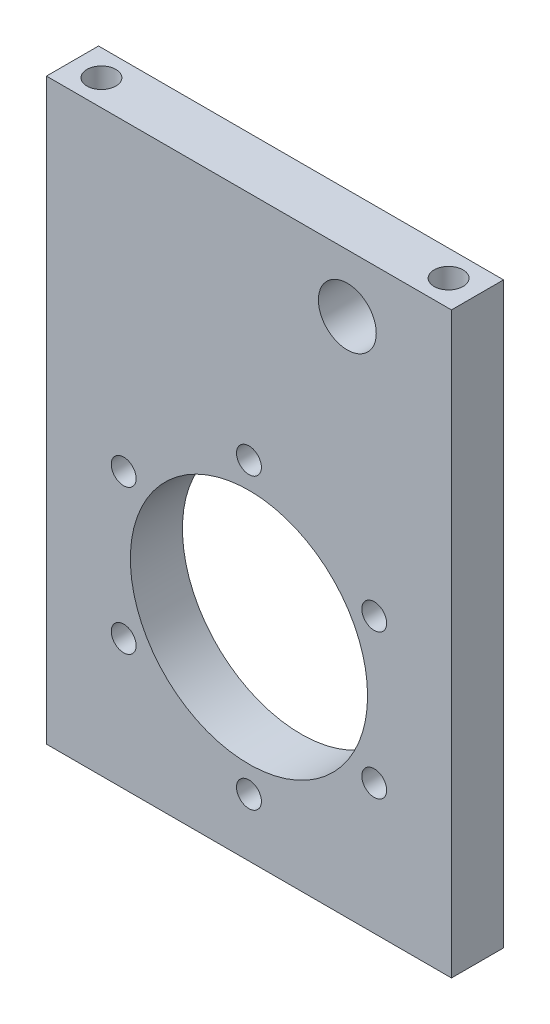
ISO-10303-21;
HEADER;
FILE_DESCRIPTION(('STEP AP214'),'2;1');
FILE_NAME('part.step','',(''),(''),'','','');
FILE_SCHEMA(('AUTOMOTIVE_DESIGN { 1 0 10303 214 1 1 1 1 }'));
ENDSEC;
DATA;
#1=APPLICATION_CONTEXT('core data for automotive mechanical design processes');
#2=APPLICATION_PROTOCOL_DEFINITION('international standard','automotive_design',2000,#1);
#3=PRODUCT_CONTEXT('',#1,'mechanical');
#4=PRODUCT('Part','Part','',(#3));
#5=PRODUCT_RELATED_PRODUCT_CATEGORY('part','',(#4));
#6=PRODUCT_DEFINITION_FORMATION('','',#4);
#7=PRODUCT_DEFINITION_CONTEXT('part definition',#1,'design');
#8=PRODUCT_DEFINITION('design','',#6,#7);
#9=PRODUCT_DEFINITION_SHAPE('','',#8);
#10=(LENGTH_UNIT() NAMED_UNIT(*) SI_UNIT(.MILLI.,.METRE.));
#11=(NAMED_UNIT(*) PLANE_ANGLE_UNIT() SI_UNIT($,.RADIAN.));
#12=(NAMED_UNIT(*) SI_UNIT($,.STERADIAN.) SOLID_ANGLE_UNIT());
#13=UNCERTAINTY_MEASURE_WITH_UNIT(LENGTH_MEASURE(1.E-05),#10,'distance_accuracy_value','');
#14=(GEOMETRIC_REPRESENTATION_CONTEXT(3) GLOBAL_UNCERTAINTY_ASSIGNED_CONTEXT((#13)) GLOBAL_UNIT_ASSIGNED_CONTEXT((#10,
#11,#12)) REPRESENTATION_CONTEXT('',''));
#15=CARTESIAN_POINT('',(0.,0.,0.));
#16=DIRECTION('',(0.,0.,1.));
#17=DIRECTION('',(1.,0.,0.));
#18=AXIS2_PLACEMENT_3D('',#15,#16,#17);
#19=CARTESIAN_POINT('',(0.,0.,-4.5));
#20=DIRECTION('',(0.,0.,1.));
#21=DIRECTION('',(-1.,0.,0.));
#22=AXIS2_PLACEMENT_3D('',#19,#20,#21);
#23=PLANE('',#22);
#24=CARTESIAN_POINT('',(52.,90.,-4.5));
#25=DIRECTION('',(0.,0.,1.));
#26=DIRECTION('',(1.,0.,0.));
#27=AXIS2_PLACEMENT_3D('',#24,#25,#26);
#28=CIRCLE('',#27,5.);
#29=CARTESIAN_POINT('',(57.,90.,-4.5));
#30=VERTEX_POINT('',#29);
#31=EDGE_CURVE('E300',#30,#30,#28,.T.);
#32=ORIENTED_EDGE('',*,*,#31,.T.);
#33=EDGE_LOOP('',(#32));
#34=FACE_BOUND('',#33,.T.);
#35=CARTESIAN_POINT('',(56.6506350946108,47.5000000000003,-4.5));
#36=DIRECTION('',(0.,0.,1.));
#37=DIRECTION('',(1.,0.,0.));
#38=AXIS2_PLACEMENT_3D('',#35,#36,#37);
#39=CIRCLE('',#38,4.);
#40=CARTESIAN_POINT('',(60.6506350946108,47.5000000000003,-4.5));
#41=VERTEX_POINT('',#40);
#42=EDGE_CURVE('E302',#41,#41,#39,.T.);
#43=ORIENTED_EDGE('',*,*,#42,.T.);
#44=EDGE_LOOP('',(#43));
#45=FACE_BOUND('',#44,.T.);
#46=CARTESIAN_POINT('',(56.6506350946111,22.5000000000002,-4.5));
#47=DIRECTION('',(0.,0.,1.));
#48=DIRECTION('',(1.,0.,0.));
#49=AXIS2_PLACEMENT_3D('',#46,#47,#48);
#50=CIRCLE('',#49,4.);
#51=CARTESIAN_POINT('',(60.6506350946111,22.5000000000002,-4.5));
#52=VERTEX_POINT('',#51);
#53=EDGE_CURVE('E315',#52,#52,#50,.T.);
#54=ORIENTED_EDGE('',*,*,#53,.T.);
#55=EDGE_LOOP('',(#54));
#56=FACE_BOUND('',#55,.T.);
#57=CARTESIAN_POINT('',(35.,10.,-4.5));
#58=DIRECTION('',(0.,0.,1.));
#59=DIRECTION('',(1.,0.,0.));
#60=AXIS2_PLACEMENT_3D('',#57,#58,#59);
#61=CIRCLE('',#60,4.);
#62=CARTESIAN_POINT('',(39.,10.,-4.5));
#63=VERTEX_POINT('',#62);
#64=EDGE_CURVE('E327',#63,#63,#61,.T.);
#65=ORIENTED_EDGE('',*,*,#64,.T.);
#66=EDGE_LOOP('',(#65));
#67=FACE_BOUND('',#66,.T.);
#68=CARTESIAN_POINT('',(13.3493649053891,22.4999999999999,-4.5));
#69=DIRECTION('',(0.,0.,1.));
#70=DIRECTION('',(1.,0.,0.));
#71=AXIS2_PLACEMENT_3D('',#68,#69,#70);
#72=CIRCLE('',#71,4.);
#73=CARTESIAN_POINT('',(17.3493649053891,22.4999999999999,-4.5));
#74=VERTEX_POINT('',#73);
#75=EDGE_CURVE('E339',#74,#74,#72,.T.);
#76=ORIENTED_EDGE('',*,*,#75,.T.);
#77=EDGE_LOOP('',(#76));
#78=FACE_BOUND('',#77,.T.);
#79=CARTESIAN_POINT('',(35.,60.,-4.5));
#80=DIRECTION('',(0.,0.,1.));
#81=DIRECTION('',(1.,0.,0.));
#82=AXIS2_PLACEMENT_3D('',#79,#80,#81);
#83=CIRCLE('',#82,4.);
#84=CARTESIAN_POINT('',(39.,60.,-4.5));
#85=VERTEX_POINT('',#84);
#86=EDGE_CURVE('E363',#85,#85,#83,.T.);
#87=ORIENTED_EDGE('',*,*,#86,.T.);
#88=EDGE_LOOP('',(#87));
#89=FACE_BOUND('',#88,.T.);
#90=CARTESIAN_POINT('',(35.,35.,-4.5));
#91=DIRECTION('',(0.,0.,1.));
#92=DIRECTION('',(1.,0.,0.));
#93=AXIS2_PLACEMENT_3D('',#90,#91,#92);
#94=CIRCLE('',#93,20.5);
#95=CARTESIAN_POINT('',(55.5,35.,-4.5));
#96=VERTEX_POINT('',#95);
#97=EDGE_CURVE('E133',#96,#96,#94,.T.);
#98=ORIENTED_EDGE('',*,*,#97,.T.);
#99=EDGE_LOOP('',(#98));
#100=FACE_BOUND('',#99,.T.);
#101=DIRECTION('',(0.,-1.,0.));
#102=VECTOR('',#101,1.);
#103=CARTESIAN_POINT('',(0.,0.,-4.5));
#104=LINE('',#103,#102);
#105=CARTESIAN_POINT('',(0.,100.,-4.5));
#106=VERTEX_POINT('',#105);
#107=CARTESIAN_POINT('',(0.,0.,-4.5));
#108=VERTEX_POINT('',#107);
#109=EDGE_CURVE('E140',#106,#108,#104,.T.);
#110=ORIENTED_EDGE('',*,*,#109,.F.);
#111=DIRECTION('',(-1.,0.,0.));
#112=VECTOR('',#111,1.);
#113=CARTESIAN_POINT('',(0.,100.,-4.5));
#114=LINE('',#113,#112);
#115=CARTESIAN_POINT('',(70.,100.,-4.5));
#116=VERTEX_POINT('',#115);
#117=EDGE_CURVE('E147',#116,#106,#114,.T.);
#118=ORIENTED_EDGE('',*,*,#117,.F.);
#119=DIRECTION('',(0.,1.,0.));
#120=VECTOR('',#119,1.);
#121=CARTESIAN_POINT('',(70.,0.,-4.5));
#122=LINE('',#121,#120);
#123=CARTESIAN_POINT('',(70.,0.,-4.5));
#124=VERTEX_POINT('',#123);
#125=EDGE_CURVE('E144',#124,#116,#122,.T.);
#126=ORIENTED_EDGE('',*,*,#125,.F.);
#127=DIRECTION('',(1.,0.,0.));
#128=VECTOR('',#127,1.);
#129=CARTESIAN_POINT('',(0.,0.,-4.5));
#130=LINE('',#129,#128);
#131=EDGE_CURVE('E142',#108,#124,#130,.T.);
#132=ORIENTED_EDGE('',*,*,#131,.F.);
#133=EDGE_LOOP('',(#110,#118,#126,#132));
#134=FACE_BOUND('',#133,.T.);
#135=CARTESIAN_POINT('',(13.349364905389,47.5,-4.5));
#136=DIRECTION('',(0.,0.,1.));
#137=DIRECTION('',(1.,0.,0.));
#138=AXIS2_PLACEMENT_3D('',#135,#136,#137);
#139=CIRCLE('',#138,4.);
#140=CARTESIAN_POINT('',(17.349364905389,47.5,-4.5));
#141=VERTEX_POINT('',#140);
#142=EDGE_CURVE('E351',#141,#141,#139,.T.);
#143=ORIENTED_EDGE('',*,*,#142,.T.);
#144=EDGE_LOOP('',(#143));
#145=FACE_BOUND('',#144,.T.);
#146=ADVANCED_FACE('F39',(#34,#45,#56,#67,#78,#89,#100,#134,#145),#23,.F.);
#147=CARTESIAN_POINT('',(0.,0.,-4.5));
#148=DIRECTION('',(1.,0.,0.));
#149=DIRECTION('',(0.,0.,1.));
#150=AXIS2_PLACEMENT_3D('',#147,#148,#149);
#151=PLANE('',#150);
#152=DIRECTION('',(0.,-1.,0.));
#153=VECTOR('',#152,1.);
#154=CARTESIAN_POINT('',(0.,0.,4.5));
#155=LINE('',#154,#153);
#156=CARTESIAN_POINT('',(0.,100.,4.5));
#157=VERTEX_POINT('',#156);
#158=CARTESIAN_POINT('',(0.,0.,4.5));
#159=VERTEX_POINT('',#158);
#160=EDGE_CURVE('E139',#157,#159,#155,.T.);
#161=ORIENTED_EDGE('',*,*,#160,.F.);
#162=DIRECTION('',(0.,0.,1.));
#163=VECTOR('',#162,1.);
#164=CARTESIAN_POINT('',(0.,100.,-4.5));
#165=LINE('',#164,#163);
#166=EDGE_CURVE('E57',#106,#157,#165,.T.);
#167=ORIENTED_EDGE('',*,*,#166,.F.);
#168=ORIENTED_EDGE('',*,*,#109,.T.);
#169=DIRECTION('',(0.,0.,1.));
#170=VECTOR('',#169,1.);
#171=CARTESIAN_POINT('',(0.,0.,-4.5));
#172=LINE('',#171,#170);
#173=EDGE_CURVE('E11',#108,#159,#172,.T.);
#174=ORIENTED_EDGE('',*,*,#173,.T.);
#175=EDGE_LOOP('',(#161,#167,#168,#174));
#176=FACE_BOUND('',#175,.T.);
#177=ADVANCED_FACE('F41',(#176),#151,.F.);
#178=CARTESIAN_POINT('',(0.,0.,-4.5));
#179=DIRECTION('',(0.,1.,0.));
#180=DIRECTION('',(0.,0.,-1.));
#181=AXIS2_PLACEMENT_3D('',#178,#179,#180);
#182=PLANE('',#181);
#183=CARTESIAN_POINT('',(65.,0.,0.));
#184=DIRECTION('',(0.,1.,0.));
#185=DIRECTION('',(0.,0.,1.));
#186=AXIS2_PLACEMENT_3D('',#183,#184,#185);
#187=CIRCLE('',#186,2.49999999999999);
#188=CARTESIAN_POINT('',(65.,0.,2.49999999999999));
#189=VERTEX_POINT('',#188);
#190=EDGE_CURVE('E121',#189,#189,#187,.T.);
#191=ORIENTED_EDGE('',*,*,#190,.T.);
#192=EDGE_LOOP('',(#191));
#193=FACE_BOUND('',#192,.T.);
#194=CARTESIAN_POINT('',(5.,0.,0.));
#195=DIRECTION('',(0.,1.,0.));
#196=DIRECTION('',(0.,0.,1.));
#197=AXIS2_PLACEMENT_3D('',#194,#195,#196);
#198=CIRCLE('',#197,2.49999999999999);
#199=CARTESIAN_POINT('',(5.,0.,2.49999999999999));
#200=VERTEX_POINT('',#199);
#201=EDGE_CURVE('E127',#200,#200,#198,.T.);
#202=ORIENTED_EDGE('',*,*,#201,.T.);
#203=EDGE_LOOP('',(#202));
#204=FACE_BOUND('',#203,.T.);
#205=DIRECTION('',(1.,0.,0.));
#206=VECTOR('',#205,1.);
#207=CARTESIAN_POINT('',(0.,0.,4.5));
#208=LINE('',#207,#206);
#209=CARTESIAN_POINT('',(70.,0.,4.5));
#210=VERTEX_POINT('',#209);
#211=EDGE_CURVE('E150',#159,#210,#208,.T.);
#212=ORIENTED_EDGE('',*,*,#211,.F.);
#213=ORIENTED_EDGE('',*,*,#173,.F.);
#214=ORIENTED_EDGE('',*,*,#131,.T.);
#215=DIRECTION('',(0.,0.,1.));
#216=VECTOR('',#215,1.);
#217=CARTESIAN_POINT('',(70.,0.,-4.5));
#218=LINE('',#217,#216);
#219=EDGE_CURVE('E49',#124,#210,#218,.T.);
#220=ORIENTED_EDGE('',*,*,#219,.T.);
#221=EDGE_LOOP('',(#212,#213,#214,#220));
#222=FACE_BOUND('',#221,.T.);
#223=ADVANCED_FACE('F160',(#193,#204,#222),#182,.F.);
#224=CARTESIAN_POINT('',(70.,0.,-4.5));
#225=DIRECTION('',(-1.,0.,0.));
#226=DIRECTION('',(0.,0.,-1.));
#227=AXIS2_PLACEMENT_3D('',#224,#225,#226);
#228=PLANE('',#227);
#229=DIRECTION('',(0.,1.,0.));
#230=VECTOR('',#229,1.);
#231=CARTESIAN_POINT('',(70.,0.,4.5));
#232=LINE('',#231,#230);
#233=CARTESIAN_POINT('',(70.,100.,4.5));
#234=VERTEX_POINT('',#233);
#235=EDGE_CURVE('E153',#210,#234,#232,.T.);
#236=ORIENTED_EDGE('',*,*,#235,.F.);
#237=ORIENTED_EDGE('',*,*,#219,.F.);
#238=ORIENTED_EDGE('',*,*,#125,.T.);
#239=DIRECTION('',(0.,0.,1.));
#240=VECTOR('',#239,1.);
#241=CARTESIAN_POINT('',(70.,100.,-4.5));
#242=LINE('',#241,#240);
#243=EDGE_CURVE('E157',#116,#234,#242,.T.);
#244=ORIENTED_EDGE('',*,*,#243,.T.);
#245=EDGE_LOOP('',(#236,#237,#238,#244));
#246=FACE_BOUND('',#245,.T.);
#247=ADVANCED_FACE('F168',(#246),#228,.F.);
#248=CARTESIAN_POINT('',(0.,100.,-4.5));
#249=DIRECTION('',(0.,-1.,0.));
#250=DIRECTION('',(0.,0.,1.));
#251=AXIS2_PLACEMENT_3D('',#248,#249,#250);
#252=PLANE('',#251);
#253=CARTESIAN_POINT('',(65.,100.,0.));
#254=DIRECTION('',(0.,-1.,0.));
#255=DIRECTION('',(0.,0.,-1.));
#256=AXIS2_PLACEMENT_3D('',#253,#254,#255);
#257=CIRCLE('',#256,2.49999999999999);
#258=CARTESIAN_POINT('',(65.,100.,-2.49999999999999));
#259=VERTEX_POINT('',#258);
#260=EDGE_CURVE('E109',#259,#259,#257,.T.);
#261=ORIENTED_EDGE('',*,*,#260,.T.);
#262=EDGE_LOOP('',(#261));
#263=FACE_BOUND('',#262,.T.);
#264=CARTESIAN_POINT('',(5.,100.,0.));
#265=DIRECTION('',(0.,-1.,0.));
#266=DIRECTION('',(0.,0.,-1.));
#267=AXIS2_PLACEMENT_3D('',#264,#265,#266);
#268=CIRCLE('',#267,2.49999999999999);
#269=CARTESIAN_POINT('',(5.,100.,-2.49999999999999));
#270=VERTEX_POINT('',#269);
#271=EDGE_CURVE('E108',#270,#270,#268,.T.);
#272=ORIENTED_EDGE('',*,*,#271,.T.);
#273=EDGE_LOOP('',(#272));
#274=FACE_BOUND('',#273,.T.);
#275=DIRECTION('',(-1.,0.,0.));
#276=VECTOR('',#275,1.);
#277=CARTESIAN_POINT('',(0.,100.,4.5));
#278=LINE('',#277,#276);
#279=EDGE_CURVE('E74',#234,#157,#278,.T.);
#280=ORIENTED_EDGE('',*,*,#279,.F.);
#281=ORIENTED_EDGE('',*,*,#243,.F.);
#282=ORIENTED_EDGE('',*,*,#117,.T.);
#283=ORIENTED_EDGE('',*,*,#166,.T.);
#284=EDGE_LOOP('',(#280,#281,#282,#283));
#285=FACE_BOUND('',#284,.T.);
#286=ADVANCED_FACE('F169',(#263,#274,#285),#252,.F.);
#287=CARTESIAN_POINT('',(0.,0.,4.5));
#288=DIRECTION('',(0.,0.,1.));
#289=DIRECTION('',(-1.,0.,0.));
#290=AXIS2_PLACEMENT_3D('',#287,#288,#289);
#291=PLANE('',#290);
#292=CARTESIAN_POINT('',(52.,90.,4.5));
#293=DIRECTION('',(0.,0.,-1.));
#294=DIRECTION('',(-1.,0.,0.));
#295=AXIS2_PLACEMENT_3D('',#292,#293,#294);
#296=CIRCLE('',#295,5.);
#297=CARTESIAN_POINT('',(47.,90.,4.5));
#298=VERTEX_POINT('',#297);
#299=EDGE_CURVE('E43',#298,#298,#296,.T.);
#300=ORIENTED_EDGE('',*,*,#299,.T.);
#301=EDGE_LOOP('',(#300));
#302=FACE_BOUND('',#301,.T.);
#303=CARTESIAN_POINT('',(56.6506350946108,47.5000000000003,4.5));
#304=DIRECTION('',(0.,0.,1.));
#305=DIRECTION('',(1.,0.,0.));
#306=AXIS2_PLACEMENT_3D('',#303,#304,#305);
#307=CIRCLE('',#306,2.15);
#308=CARTESIAN_POINT('',(58.8006350946108,47.5000000000003,4.5));
#309=VERTEX_POINT('',#308);
#310=EDGE_CURVE('E312',#309,#309,#307,.T.);
#311=ORIENTED_EDGE('',*,*,#310,.F.);
#312=EDGE_LOOP('',(#311));
#313=FACE_BOUND('',#312,.T.);
#314=CARTESIAN_POINT('',(56.6506350946111,22.5000000000002,4.5));
#315=DIRECTION('',(0.,0.,1.));
#316=DIRECTION('',(1.,0.,0.));
#317=AXIS2_PLACEMENT_3D('',#314,#315,#316);
#318=CIRCLE('',#317,2.15);
#319=CARTESIAN_POINT('',(58.8006350946111,22.5000000000002,4.5));
#320=VERTEX_POINT('',#319);
#321=EDGE_CURVE('E324',#320,#320,#318,.T.);
#322=ORIENTED_EDGE('',*,*,#321,.F.);
#323=EDGE_LOOP('',(#322));
#324=FACE_BOUND('',#323,.T.);
#325=CARTESIAN_POINT('',(35.,10.,4.5));
#326=DIRECTION('',(0.,0.,1.));
#327=DIRECTION('',(1.,0.,0.));
#328=AXIS2_PLACEMENT_3D('',#325,#326,#327);
#329=CIRCLE('',#328,2.15);
#330=CARTESIAN_POINT('',(37.15,10.,4.5));
#331=VERTEX_POINT('',#330);
#332=EDGE_CURVE('E336',#331,#331,#329,.T.);
#333=ORIENTED_EDGE('',*,*,#332,.F.);
#334=EDGE_LOOP('',(#333));
#335=FACE_BOUND('',#334,.T.);
#336=CARTESIAN_POINT('',(13.3493649053891,22.4999999999999,4.5));
#337=DIRECTION('',(0.,0.,1.));
#338=DIRECTION('',(1.,0.,0.));
#339=AXIS2_PLACEMENT_3D('',#336,#337,#338);
#340=CIRCLE('',#339,2.15);
#341=CARTESIAN_POINT('',(15.4993649053891,22.4999999999999,4.5));
#342=VERTEX_POINT('',#341);
#343=EDGE_CURVE('E348',#342,#342,#340,.T.);
#344=ORIENTED_EDGE('',*,*,#343,.F.);
#345=EDGE_LOOP('',(#344));
#346=FACE_BOUND('',#345,.T.);
#347=CARTESIAN_POINT('',(13.349364905389,47.5,4.5));
#348=DIRECTION('',(0.,0.,1.));
#349=DIRECTION('',(1.,0.,0.));
#350=AXIS2_PLACEMENT_3D('',#347,#348,#349);
#351=CIRCLE('',#350,2.15);
#352=CARTESIAN_POINT('',(15.499364905389,47.5,4.5));
#353=VERTEX_POINT('',#352);
#354=EDGE_CURVE('E360',#353,#353,#351,.T.);
#355=ORIENTED_EDGE('',*,*,#354,.F.);
#356=EDGE_LOOP('',(#355));
#357=FACE_BOUND('',#356,.T.);
#358=CARTESIAN_POINT('',(35.,60.,4.5));
#359=DIRECTION('',(0.,0.,1.));
#360=DIRECTION('',(1.,0.,0.));
#361=AXIS2_PLACEMENT_3D('',#358,#359,#360);
#362=CIRCLE('',#361,2.15);
#363=CARTESIAN_POINT('',(37.15,60.,4.5));
#364=VERTEX_POINT('',#363);
#365=EDGE_CURVE('E115',#364,#364,#362,.T.);
#366=ORIENTED_EDGE('',*,*,#365,.F.);
#367=EDGE_LOOP('',(#366));
#368=FACE_BOUND('',#367,.T.);
#369=CARTESIAN_POINT('',(35.,35.,4.5));
#370=DIRECTION('',(0.,0.,1.));
#371=DIRECTION('',(1.,0.,0.));
#372=AXIS2_PLACEMENT_3D('',#369,#370,#371);
#373=CIRCLE('',#372,20.5);
#374=CARTESIAN_POINT('',(55.5,35.,4.5));
#375=VERTEX_POINT('',#374);
#376=EDGE_CURVE('E136',#375,#375,#373,.T.);
#377=ORIENTED_EDGE('',*,*,#376,.F.);
#378=EDGE_LOOP('',(#377));
#379=FACE_BOUND('',#378,.T.);
#380=ORIENTED_EDGE('',*,*,#160,.T.);
#381=ORIENTED_EDGE('',*,*,#211,.T.);
#382=ORIENTED_EDGE('',*,*,#235,.T.);
#383=ORIENTED_EDGE('',*,*,#279,.T.);
#384=EDGE_LOOP('',(#380,#381,#382,#383));
#385=FACE_BOUND('',#384,.T.);
#386=ADVANCED_FACE('F163',(#302,#313,#324,#335,#346,#357,#368,#379,#385),#291,.T.);
#387=CARTESIAN_POINT('',(35.,35.,4.5));
#388=DIRECTION('',(0.,0.,-1.));
#389=DIRECTION('',(1.,0.,0.));
#390=AXIS2_PLACEMENT_3D('',#387,#388,#389);
#391=CYLINDRICAL_SURFACE('',#390,20.5);
#392=ORIENTED_EDGE('',*,*,#376,.T.);
#393=EDGE_LOOP('',(#392));
#394=FACE_BOUND('',#393,.T.);
#395=ORIENTED_EDGE('',*,*,#97,.F.);
#396=EDGE_LOOP('',(#395));
#397=FACE_BOUND('',#396,.T.);
#398=ADVANCED_FACE('F177',(#394,#397),#391,.F.);
#399=CARTESIAN_POINT('',(5.,15.,0.));
#400=DIRECTION('',(0.,-1.,0.));
#401=DIRECTION('',(0.,0.,1.));
#402=AXIS2_PLACEMENT_3D('',#399,#400,#401);
#403=CONICAL_SURFACE('',#402,2.49999999999999,1.02974425867665);
#404=CARTESIAN_POINT('',(5.,16.5021515475689,0.));
#405=VERTEX_POINT('',#404);
#406=VERTEX_LOOP('',#405);
#407=FACE_BOUND('',#406,.T.);
#408=CARTESIAN_POINT('',(5.,15.,0.));
#409=DIRECTION('',(0.,1.,0.));
#410=DIRECTION('',(0.,0.,1.));
#411=AXIS2_PLACEMENT_3D('',#408,#409,#410);
#412=CIRCLE('',#411,2.49999999999999);
#413=CARTESIAN_POINT('',(5.,15.,2.49999999999999));
#414=VERTEX_POINT('',#413);
#415=EDGE_CURVE('E130',#414,#414,#412,.T.);
#416=ORIENTED_EDGE('',*,*,#415,.F.);
#417=EDGE_LOOP('',(#416));
#418=FACE_BOUND('',#417,.T.);
#419=ADVANCED_FACE('F193',(#407,#418),#403,.F.);
#420=CARTESIAN_POINT('',(5.,0.,0.));
#421=DIRECTION('',(0.,-1.,0.));
#422=DIRECTION('',(0.,0.,1.));
#423=AXIS2_PLACEMENT_3D('',#420,#421,#422);
#424=CYLINDRICAL_SURFACE('',#423,2.49999999999999);
#425=ORIENTED_EDGE('',*,*,#415,.T.);
#426=EDGE_LOOP('',(#425));
#427=FACE_BOUND('',#426,.T.);
#428=ORIENTED_EDGE('',*,*,#201,.F.);
#429=EDGE_LOOP('',(#428));
#430=FACE_BOUND('',#429,.T.);
#431=ADVANCED_FACE('F197',(#427,#430),#424,.F.);
#432=CARTESIAN_POINT('',(65.,15.,0.));
#433=DIRECTION('',(0.,-1.,0.));
#434=DIRECTION('',(0.,0.,1.));
#435=AXIS2_PLACEMENT_3D('',#432,#433,#434);
#436=CONICAL_SURFACE('',#435,2.49999999999999,1.02974425867665);
#437=CARTESIAN_POINT('',(65.,16.5021515475689,0.));
#438=VERTEX_POINT('',#437);
#439=VERTEX_LOOP('',#438);
#440=FACE_BOUND('',#439,.T.);
#441=CARTESIAN_POINT('',(65.,15.,0.));
#442=DIRECTION('',(0.,1.,0.));
#443=DIRECTION('',(0.,0.,1.));
#444=AXIS2_PLACEMENT_3D('',#441,#442,#443);
#445=CIRCLE('',#444,2.49999999999999);
#446=CARTESIAN_POINT('',(65.,15.,2.49999999999999));
#447=VERTEX_POINT('',#446);
#448=EDGE_CURVE('E124',#447,#447,#445,.T.);
#449=ORIENTED_EDGE('',*,*,#448,.F.);
#450=EDGE_LOOP('',(#449));
#451=FACE_BOUND('',#450,.T.);
#452=ADVANCED_FACE('F201',(#440,#451),#436,.F.);
#453=CARTESIAN_POINT('',(65.,0.,0.));
#454=DIRECTION('',(0.,-1.,0.));
#455=DIRECTION('',(0.,0.,1.));
#456=AXIS2_PLACEMENT_3D('',#453,#454,#455);
#457=CYLINDRICAL_SURFACE('',#456,2.49999999999999);
#458=ORIENTED_EDGE('',*,*,#448,.T.);
#459=EDGE_LOOP('',(#458));
#460=FACE_BOUND('',#459,.T.);
#461=ORIENTED_EDGE('',*,*,#190,.F.);
#462=EDGE_LOOP('',(#461));
#463=FACE_BOUND('',#462,.T.);
#464=ADVANCED_FACE('F205',(#460,#463),#457,.F.);
#465=CARTESIAN_POINT('',(5.,85.,0.));
#466=DIRECTION('',(0.,1.,0.));
#467=DIRECTION('',(0.,0.,-1.));
#468=AXIS2_PLACEMENT_3D('',#465,#466,#467);
#469=CONICAL_SURFACE('',#468,2.49999999999999,1.02974425867665);
#470=CARTESIAN_POINT('',(5.,83.4978484524311,0.));
#471=VERTEX_POINT('',#470);
#472=VERTEX_LOOP('',#471);
#473=FACE_BOUND('',#472,.T.);
#474=CARTESIAN_POINT('',(5.,85.,0.));
#475=DIRECTION('',(0.,-1.,0.));
#476=DIRECTION('',(0.,0.,-1.));
#477=AXIS2_PLACEMENT_3D('',#474,#475,#476);
#478=CIRCLE('',#477,2.49999999999999);
#479=CARTESIAN_POINT('',(5.,85.,-2.49999999999999));
#480=VERTEX_POINT('',#479);
#481=EDGE_CURVE('E112',#480,#480,#478,.T.);
#482=ORIENTED_EDGE('',*,*,#481,.F.);
#483=EDGE_LOOP('',(#482));
#484=FACE_BOUND('',#483,.T.);
#485=ADVANCED_FACE('F209',(#473,#484),#469,.F.);
#486=CARTESIAN_POINT('',(5.,100.,0.));
#487=DIRECTION('',(0.,1.,0.));
#488=DIRECTION('',(0.,0.,-1.));
#489=AXIS2_PLACEMENT_3D('',#486,#487,#488);
#490=CYLINDRICAL_SURFACE('',#489,2.49999999999999);
#491=ORIENTED_EDGE('',*,*,#481,.T.);
#492=EDGE_LOOP('',(#491));
#493=FACE_BOUND('',#492,.T.);
#494=ORIENTED_EDGE('',*,*,#271,.F.);
#495=EDGE_LOOP('',(#494));
#496=FACE_BOUND('',#495,.T.);
#497=ADVANCED_FACE('F102',(#493,#496),#490,.F.);
#498=CARTESIAN_POINT('',(65.,85.,0.));
#499=DIRECTION('',(0.,1.,0.));
#500=DIRECTION('',(0.,0.,-1.));
#501=AXIS2_PLACEMENT_3D('',#498,#499,#500);
#502=CONICAL_SURFACE('',#501,2.49999999999999,1.02974425867665);
#503=CARTESIAN_POINT('',(65.,83.4978484524311,0.));
#504=VERTEX_POINT('',#503);
#505=VERTEX_LOOP('',#504);
#506=FACE_BOUND('',#505,.T.);
#507=CARTESIAN_POINT('',(65.,85.,0.));
#508=DIRECTION('',(0.,-1.,0.));
#509=DIRECTION('',(0.,0.,-1.));
#510=AXIS2_PLACEMENT_3D('',#507,#508,#509);
#511=CIRCLE('',#510,2.49999999999999);
#512=CARTESIAN_POINT('',(65.,85.,-2.49999999999999));
#513=VERTEX_POINT('',#512);
#514=EDGE_CURVE('E106',#513,#513,#511,.T.);
#515=ORIENTED_EDGE('',*,*,#514,.F.);
#516=EDGE_LOOP('',(#515));
#517=FACE_BOUND('',#516,.T.);
#518=ADVANCED_FACE('F98',(#506,#517),#502,.F.);
#519=CARTESIAN_POINT('',(65.,100.,0.));
#520=DIRECTION('',(0.,1.,0.));
#521=DIRECTION('',(0.,0.,-1.));
#522=AXIS2_PLACEMENT_3D('',#519,#520,#521);
#523=CYLINDRICAL_SURFACE('',#522,2.49999999999999);
#524=ORIENTED_EDGE('',*,*,#514,.T.);
#525=EDGE_LOOP('',(#524));
#526=FACE_BOUND('',#525,.T.);
#527=ORIENTED_EDGE('',*,*,#260,.F.);
#528=EDGE_LOOP('',(#527));
#529=FACE_BOUND('',#528,.T.);
#530=ADVANCED_FACE('F101',(#526,#529),#523,.F.);
#531=CARTESIAN_POINT('',(35.,60.,-4.5));
#532=DIRECTION('',(0.,0.,-1.));
#533=DIRECTION('',(1.,0.,0.));
#534=AXIS2_PLACEMENT_3D('',#531,#532,#533);
#535=CYLINDRICAL_SURFACE('',#534,2.15);
#536=ORIENTED_EDGE('',*,*,#365,.T.);
#537=EDGE_LOOP('',(#536));
#538=FACE_BOUND('',#537,.T.);
#539=CARTESIAN_POINT('',(35.,60.,-0.1));
#540=DIRECTION('',(0.,0.,1.));
#541=DIRECTION('',(1.,0.,0.));
#542=AXIS2_PLACEMENT_3D('',#539,#540,#541);
#543=CIRCLE('',#542,2.15);
#544=CARTESIAN_POINT('',(37.15,60.,-0.1));
#545=VERTEX_POINT('',#544);
#546=EDGE_CURVE('E369',#545,#545,#543,.T.);
#547=ORIENTED_EDGE('',*,*,#546,.F.);
#548=EDGE_LOOP('',(#547));
#549=FACE_BOUND('',#548,.T.);
#550=ADVANCED_FACE('F219',(#538,#549),#535,.F.);
#551=CARTESIAN_POINT('',(37.15,60.,-0.1));
#552=DIRECTION('',(0.,0.,1.));
#553=DIRECTION('',(-1.,0.,0.));
#554=AXIS2_PLACEMENT_3D('',#551,#552,#553);
#555=PLANE('',#554);
#556=ORIENTED_EDGE('',*,*,#546,.T.);
#557=EDGE_LOOP('',(#556));
#558=FACE_BOUND('',#557,.T.);
#559=CARTESIAN_POINT('',(35.,60.,-0.1));
#560=DIRECTION('',(0.,0.,1.));
#561=DIRECTION('',(1.,0.,0.));
#562=AXIS2_PLACEMENT_3D('',#559,#560,#561);
#563=CIRCLE('',#562,4.);
#564=CARTESIAN_POINT('',(39.,60.,-0.1));
#565=VERTEX_POINT('',#564);
#566=EDGE_CURVE('E366',#565,#565,#563,.T.);
#567=ORIENTED_EDGE('',*,*,#566,.F.);
#568=EDGE_LOOP('',(#567));
#569=FACE_BOUND('',#568,.T.);
#570=ADVANCED_FACE('F222',(#558,#569),#555,.F.);
#571=CARTESIAN_POINT('',(35.,60.,-4.5));
#572=DIRECTION('',(0.,0.,-1.));
#573=DIRECTION('',(1.,0.,0.));
#574=AXIS2_PLACEMENT_3D('',#571,#572,#573);
#575=CYLINDRICAL_SURFACE('',#574,4.);
#576=ORIENTED_EDGE('',*,*,#566,.T.);
#577=EDGE_LOOP('',(#576));
#578=FACE_BOUND('',#577,.T.);
#579=ORIENTED_EDGE('',*,*,#86,.F.);
#580=EDGE_LOOP('',(#579));
#581=FACE_BOUND('',#580,.T.);
#582=ADVANCED_FACE('F226',(#578,#581),#575,.F.);
#583=CARTESIAN_POINT('',(13.349364905389,47.5,-4.5));
#584=DIRECTION('',(0.,0.,-1.));
#585=DIRECTION('',(1.,0.,0.));
#586=AXIS2_PLACEMENT_3D('',#583,#584,#585);
#587=CYLINDRICAL_SURFACE('',#586,2.15);
#588=ORIENTED_EDGE('',*,*,#354,.T.);
#589=EDGE_LOOP('',(#588));
#590=FACE_BOUND('',#589,.T.);
#591=CARTESIAN_POINT('',(13.349364905389,47.5,-0.1));
#592=DIRECTION('',(0.,0.,1.));
#593=DIRECTION('',(1.,0.,0.));
#594=AXIS2_PLACEMENT_3D('',#591,#592,#593);
#595=CIRCLE('',#594,2.15);
#596=CARTESIAN_POINT('',(15.499364905389,47.5,-0.1));
#597=VERTEX_POINT('',#596);
#598=EDGE_CURVE('E357',#597,#597,#595,.T.);
#599=ORIENTED_EDGE('',*,*,#598,.F.);
#600=EDGE_LOOP('',(#599));
#601=FACE_BOUND('',#600,.T.);
#602=ADVANCED_FACE('F230',(#590,#601),#587,.F.);
#603=CARTESIAN_POINT('',(15.499364905389,47.5,-0.1));
#604=DIRECTION('',(0.,0.,1.));
#605=DIRECTION('',(-1.,0.,0.));
#606=AXIS2_PLACEMENT_3D('',#603,#604,#605);
#607=PLANE('',#606);
#608=ORIENTED_EDGE('',*,*,#598,.T.);
#609=EDGE_LOOP('',(#608));
#610=FACE_BOUND('',#609,.T.);
#611=CARTESIAN_POINT('',(13.349364905389,47.5,-0.1));
#612=DIRECTION('',(0.,0.,1.));
#613=DIRECTION('',(1.,0.,0.));
#614=AXIS2_PLACEMENT_3D('',#611,#612,#613);
#615=CIRCLE('',#614,4.);
#616=CARTESIAN_POINT('',(17.349364905389,47.5,-0.1));
#617=VERTEX_POINT('',#616);
#618=EDGE_CURVE('E354',#617,#617,#615,.T.);
#619=ORIENTED_EDGE('',*,*,#618,.F.);
#620=EDGE_LOOP('',(#619));
#621=FACE_BOUND('',#620,.T.);
#622=ADVANCED_FACE('F234',(#610,#621),#607,.F.);
#623=CARTESIAN_POINT('',(13.349364905389,47.5,-4.5));
#624=DIRECTION('',(0.,0.,-1.));
#625=DIRECTION('',(1.,0.,0.));
#626=AXIS2_PLACEMENT_3D('',#623,#624,#625);
#627=CYLINDRICAL_SURFACE('',#626,4.);
#628=ORIENTED_EDGE('',*,*,#618,.T.);
#629=EDGE_LOOP('',(#628));
#630=FACE_BOUND('',#629,.T.);
#631=ORIENTED_EDGE('',*,*,#142,.F.);
#632=EDGE_LOOP('',(#631));
#633=FACE_BOUND('',#632,.T.);
#634=ADVANCED_FACE('F238',(#630,#633),#627,.F.);
#635=CARTESIAN_POINT('',(13.3493649053891,22.4999999999999,-4.5));
#636=DIRECTION('',(0.,0.,-1.));
#637=DIRECTION('',(1.,0.,0.));
#638=AXIS2_PLACEMENT_3D('',#635,#636,#637);
#639=CYLINDRICAL_SURFACE('',#638,2.15);
#640=ORIENTED_EDGE('',*,*,#343,.T.);
#641=EDGE_LOOP('',(#640));
#642=FACE_BOUND('',#641,.T.);
#643=CARTESIAN_POINT('',(13.3493649053891,22.4999999999999,-0.1));
#644=DIRECTION('',(0.,0.,1.));
#645=DIRECTION('',(1.,0.,0.));
#646=AXIS2_PLACEMENT_3D('',#643,#644,#645);
#647=CIRCLE('',#646,2.15);
#648=CARTESIAN_POINT('',(15.4993649053891,22.4999999999999,-0.1));
#649=VERTEX_POINT('',#648);
#650=EDGE_CURVE('E345',#649,#649,#647,.T.);
#651=ORIENTED_EDGE('',*,*,#650,.F.);
#652=EDGE_LOOP('',(#651));
#653=FACE_BOUND('',#652,.T.);
#654=ADVANCED_FACE('F242',(#642,#653),#639,.F.);
#655=CARTESIAN_POINT('',(15.4993649053891,22.4999999999999,-0.1));
#656=DIRECTION('',(0.,0.,1.));
#657=DIRECTION('',(-1.,0.,0.));
#658=AXIS2_PLACEMENT_3D('',#655,#656,#657);
#659=PLANE('',#658);
#660=ORIENTED_EDGE('',*,*,#650,.T.);
#661=EDGE_LOOP('',(#660));
#662=FACE_BOUND('',#661,.T.);
#663=CARTESIAN_POINT('',(13.3493649053891,22.4999999999999,-0.1));
#664=DIRECTION('',(0.,0.,1.));
#665=DIRECTION('',(1.,0.,0.));
#666=AXIS2_PLACEMENT_3D('',#663,#664,#665);
#667=CIRCLE('',#666,4.);
#668=CARTESIAN_POINT('',(17.3493649053891,22.4999999999999,-0.1));
#669=VERTEX_POINT('',#668);
#670=EDGE_CURVE('E342',#669,#669,#667,.T.);
#671=ORIENTED_EDGE('',*,*,#670,.F.);
#672=EDGE_LOOP('',(#671));
#673=FACE_BOUND('',#672,.T.);
#674=ADVANCED_FACE('F246',(#662,#673),#659,.F.);
#675=CARTESIAN_POINT('',(13.3493649053891,22.4999999999999,-4.5));
#676=DIRECTION('',(0.,0.,-1.));
#677=DIRECTION('',(1.,0.,0.));
#678=AXIS2_PLACEMENT_3D('',#675,#676,#677);
#679=CYLINDRICAL_SURFACE('',#678,4.);
#680=ORIENTED_EDGE('',*,*,#670,.T.);
#681=EDGE_LOOP('',(#680));
#682=FACE_BOUND('',#681,.T.);
#683=ORIENTED_EDGE('',*,*,#75,.F.);
#684=EDGE_LOOP('',(#683));
#685=FACE_BOUND('',#684,.T.);
#686=ADVANCED_FACE('F250',(#682,#685),#679,.F.);
#687=CARTESIAN_POINT('',(35.,10.,-4.5));
#688=DIRECTION('',(0.,0.,-1.));
#689=DIRECTION('',(1.,0.,0.));
#690=AXIS2_PLACEMENT_3D('',#687,#688,#689);
#691=CYLINDRICAL_SURFACE('',#690,2.15);
#692=ORIENTED_EDGE('',*,*,#332,.T.);
#693=EDGE_LOOP('',(#692));
#694=FACE_BOUND('',#693,.T.);
#695=CARTESIAN_POINT('',(35.,10.,-0.1));
#696=DIRECTION('',(0.,0.,1.));
#697=DIRECTION('',(1.,0.,0.));
#698=AXIS2_PLACEMENT_3D('',#695,#696,#697);
#699=CIRCLE('',#698,2.15);
#700=CARTESIAN_POINT('',(37.15,10.,-0.1));
#701=VERTEX_POINT('',#700);
#702=EDGE_CURVE('E333',#701,#701,#699,.T.);
#703=ORIENTED_EDGE('',*,*,#702,.F.);
#704=EDGE_LOOP('',(#703));
#705=FACE_BOUND('',#704,.T.);
#706=ADVANCED_FACE('F254',(#694,#705),#691,.F.);
#707=CARTESIAN_POINT('',(37.15,10.,-0.1));
#708=DIRECTION('',(0.,0.,1.));
#709=DIRECTION('',(-1.,0.,0.));
#710=AXIS2_PLACEMENT_3D('',#707,#708,#709);
#711=PLANE('',#710);
#712=ORIENTED_EDGE('',*,*,#702,.T.);
#713=EDGE_LOOP('',(#712));
#714=FACE_BOUND('',#713,.T.);
#715=CARTESIAN_POINT('',(35.,10.,-0.1));
#716=DIRECTION('',(0.,0.,1.));
#717=DIRECTION('',(1.,0.,0.));
#718=AXIS2_PLACEMENT_3D('',#715,#716,#717);
#719=CIRCLE('',#718,4.);
#720=CARTESIAN_POINT('',(39.,10.,-0.1));
#721=VERTEX_POINT('',#720);
#722=EDGE_CURVE('E330',#721,#721,#719,.T.);
#723=ORIENTED_EDGE('',*,*,#722,.F.);
#724=EDGE_LOOP('',(#723));
#725=FACE_BOUND('',#724,.T.);
#726=ADVANCED_FACE('F258',(#714,#725),#711,.F.);
#727=CARTESIAN_POINT('',(35.,10.,-4.5));
#728=DIRECTION('',(0.,0.,-1.));
#729=DIRECTION('',(1.,0.,0.));
#730=AXIS2_PLACEMENT_3D('',#727,#728,#729);
#731=CYLINDRICAL_SURFACE('',#730,4.);
#732=ORIENTED_EDGE('',*,*,#722,.T.);
#733=EDGE_LOOP('',(#732));
#734=FACE_BOUND('',#733,.T.);
#735=ORIENTED_EDGE('',*,*,#64,.F.);
#736=EDGE_LOOP('',(#735));
#737=FACE_BOUND('',#736,.T.);
#738=ADVANCED_FACE('F262',(#734,#737),#731,.F.);
#739=CARTESIAN_POINT('',(56.6506350946111,22.5000000000002,-4.5));
#740=DIRECTION('',(0.,0.,-1.));
#741=DIRECTION('',(1.,0.,0.));
#742=AXIS2_PLACEMENT_3D('',#739,#740,#741);
#743=CYLINDRICAL_SURFACE('',#742,2.15);
#744=ORIENTED_EDGE('',*,*,#321,.T.);
#745=EDGE_LOOP('',(#744));
#746=FACE_BOUND('',#745,.T.);
#747=CARTESIAN_POINT('',(56.6506350946111,22.5000000000002,-0.1));
#748=DIRECTION('',(0.,0.,1.));
#749=DIRECTION('',(1.,0.,0.));
#750=AXIS2_PLACEMENT_3D('',#747,#748,#749);
#751=CIRCLE('',#750,2.15);
#752=CARTESIAN_POINT('',(58.8006350946111,22.5000000000002,-0.1));
#753=VERTEX_POINT('',#752);
#754=EDGE_CURVE('E321',#753,#753,#751,.T.);
#755=ORIENTED_EDGE('',*,*,#754,.F.);
#756=EDGE_LOOP('',(#755));
#757=FACE_BOUND('',#756,.T.);
#758=ADVANCED_FACE('F266',(#746,#757),#743,.F.);
#759=CARTESIAN_POINT('',(58.8006350946111,22.5000000000002,-0.1));
#760=DIRECTION('',(0.,0.,1.));
#761=DIRECTION('',(-1.,0.,0.));
#762=AXIS2_PLACEMENT_3D('',#759,#760,#761);
#763=PLANE('',#762);
#764=ORIENTED_EDGE('',*,*,#754,.T.);
#765=EDGE_LOOP('',(#764));
#766=FACE_BOUND('',#765,.T.);
#767=CARTESIAN_POINT('',(56.6506350946111,22.5000000000002,-0.1));
#768=DIRECTION('',(0.,0.,1.));
#769=DIRECTION('',(1.,0.,0.));
#770=AXIS2_PLACEMENT_3D('',#767,#768,#769);
#771=CIRCLE('',#770,4.);
#772=CARTESIAN_POINT('',(60.6506350946111,22.5000000000002,-0.1));
#773=VERTEX_POINT('',#772);
#774=EDGE_CURVE('E318',#773,#773,#771,.T.);
#775=ORIENTED_EDGE('',*,*,#774,.F.);
#776=EDGE_LOOP('',(#775));
#777=FACE_BOUND('',#776,.T.);
#778=ADVANCED_FACE('F270',(#766,#777),#763,.F.);
#779=CARTESIAN_POINT('',(56.6506350946111,22.5000000000002,-4.5));
#780=DIRECTION('',(0.,0.,-1.));
#781=DIRECTION('',(1.,0.,0.));
#782=AXIS2_PLACEMENT_3D('',#779,#780,#781);
#783=CYLINDRICAL_SURFACE('',#782,4.);
#784=ORIENTED_EDGE('',*,*,#774,.T.);
#785=EDGE_LOOP('',(#784));
#786=FACE_BOUND('',#785,.T.);
#787=ORIENTED_EDGE('',*,*,#53,.F.);
#788=EDGE_LOOP('',(#787));
#789=FACE_BOUND('',#788,.T.);
#790=ADVANCED_FACE('F274',(#786,#789),#783,.F.);
#791=CARTESIAN_POINT('',(56.6506350946108,47.5000000000003,-4.5));
#792=DIRECTION('',(0.,0.,-1.));
#793=DIRECTION('',(1.,0.,0.));
#794=AXIS2_PLACEMENT_3D('',#791,#792,#793);
#795=CYLINDRICAL_SURFACE('',#794,2.15);
#796=ORIENTED_EDGE('',*,*,#310,.T.);
#797=EDGE_LOOP('',(#796));
#798=FACE_BOUND('',#797,.T.);
#799=CARTESIAN_POINT('',(56.6506350946108,47.5000000000003,-0.1));
#800=DIRECTION('',(0.,0.,1.));
#801=DIRECTION('',(1.,0.,0.));
#802=AXIS2_PLACEMENT_3D('',#799,#800,#801);
#803=CIRCLE('',#802,2.15);
#804=CARTESIAN_POINT('',(58.8006350946108,47.5000000000003,-0.1));
#805=VERTEX_POINT('',#804);
#806=EDGE_CURVE('E309',#805,#805,#803,.T.);
#807=ORIENTED_EDGE('',*,*,#806,.F.);
#808=EDGE_LOOP('',(#807));
#809=FACE_BOUND('',#808,.T.);
#810=ADVANCED_FACE('F278',(#798,#809),#795,.F.);
#811=CARTESIAN_POINT('',(58.8006350946108,47.5000000000003,-0.1));
#812=DIRECTION('',(0.,0.,1.));
#813=DIRECTION('',(-1.,0.,0.));
#814=AXIS2_PLACEMENT_3D('',#811,#812,#813);
#815=PLANE('',#814);
#816=ORIENTED_EDGE('',*,*,#806,.T.);
#817=EDGE_LOOP('',(#816));
#818=FACE_BOUND('',#817,.T.);
#819=CARTESIAN_POINT('',(56.6506350946108,47.5000000000003,-0.1));
#820=DIRECTION('',(0.,0.,1.));
#821=DIRECTION('',(1.,0.,0.));
#822=AXIS2_PLACEMENT_3D('',#819,#820,#821);
#823=CIRCLE('',#822,4.);
#824=CARTESIAN_POINT('',(60.6506350946108,47.5000000000003,-0.1));
#825=VERTEX_POINT('',#824);
#826=EDGE_CURVE('E306',#825,#825,#823,.T.);
#827=ORIENTED_EDGE('',*,*,#826,.F.);
#828=EDGE_LOOP('',(#827));
#829=FACE_BOUND('',#828,.T.);
#830=ADVANCED_FACE('F282',(#818,#829),#815,.F.);
#831=CARTESIAN_POINT('',(56.6506350946108,47.5000000000003,-4.5));
#832=DIRECTION('',(0.,0.,-1.));
#833=DIRECTION('',(1.,0.,0.));
#834=AXIS2_PLACEMENT_3D('',#831,#832,#833);
#835=CYLINDRICAL_SURFACE('',#834,4.);
#836=ORIENTED_EDGE('',*,*,#826,.T.);
#837=EDGE_LOOP('',(#836));
#838=FACE_BOUND('',#837,.T.);
#839=ORIENTED_EDGE('',*,*,#42,.F.);
#840=EDGE_LOOP('',(#839));
#841=FACE_BOUND('',#840,.T.);
#842=ADVANCED_FACE('F286',(#838,#841),#835,.F.);
#843=CARTESIAN_POINT('',(52.,90.,5.5));
#844=DIRECTION('',(0.,0.,-1.));
#845=DIRECTION('',(1.,0.,0.));
#846=AXIS2_PLACEMENT_3D('',#843,#844,#845);
#847=CYLINDRICAL_SURFACE('',#846,5.);
#848=ORIENTED_EDGE('',*,*,#299,.F.);
#849=EDGE_LOOP('',(#848));
#850=FACE_BOUND('',#849,.T.);
#851=ORIENTED_EDGE('',*,*,#31,.F.);
#852=EDGE_LOOP('',(#851));
#853=FACE_BOUND('',#852,.T.);
#854=ADVANCED_FACE('F290',(#850,#853),#847,.F.);
#855=CLOSED_SHELL('',(#146,#177,#223,#247,#286,#386,#398,#419,#431,#452,#464,#485,#497,#518,
#530,#550,#570,#582,#602,#622,#634,#654,#674,#686,#706,#726,#738,#758,#778,#790,#810,#830,#842,#854));
#856=MANIFOLD_SOLID_BREP('B2',#855);
#857=ADVANCED_BREP_SHAPE_REPRESENTATION('',(#18,#856),#14);
#858=SHAPE_DEFINITION_REPRESENTATION(#9,#857);
ENDSEC;
END-ISO-10303-21;
